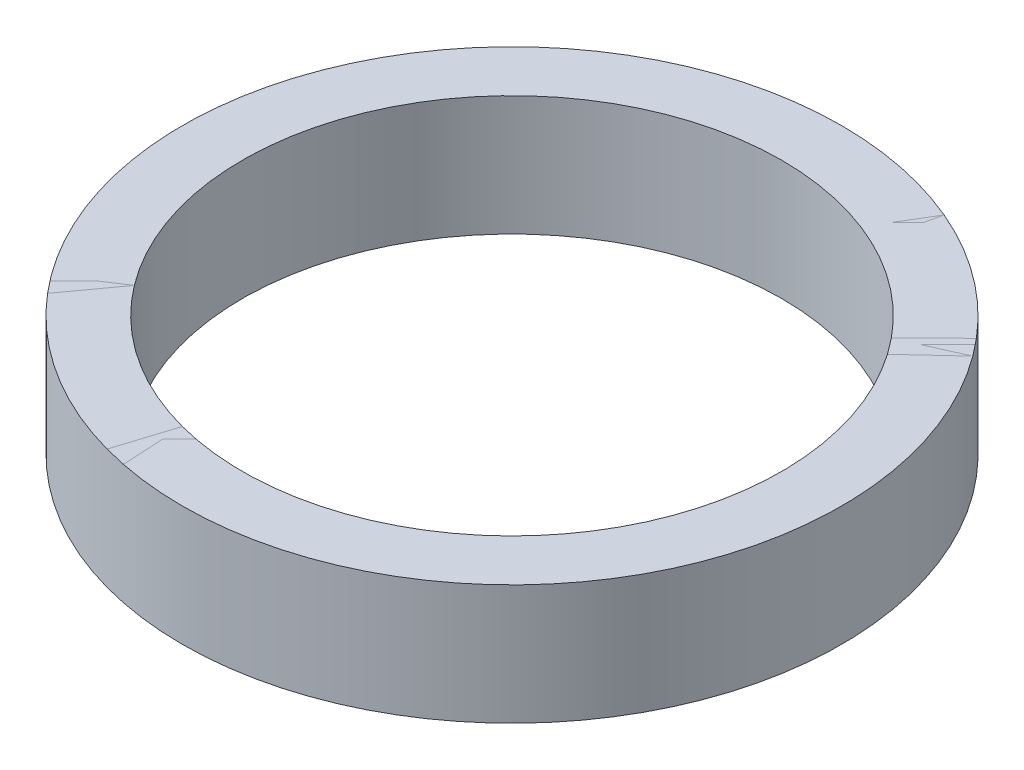
ISO-10303-21;
HEADER;
FILE_DESCRIPTION(('STEP AP214'),'2;1');
FILE_NAME('part.step','',(''),(''),'','','');
FILE_SCHEMA(('AUTOMOTIVE_DESIGN { 1 0 10303 214 1 1 1 1 }'));
ENDSEC;
DATA;
#1=APPLICATION_CONTEXT('core data for automotive mechanical design processes');
#2=APPLICATION_PROTOCOL_DEFINITION('international standard','automotive_design',2000,#1);
#3=PRODUCT_CONTEXT('',#1,'mechanical');
#4=PRODUCT('Part','Part','',(#3));
#5=PRODUCT_RELATED_PRODUCT_CATEGORY('part','',(#4));
#6=PRODUCT_DEFINITION_FORMATION('','',#4);
#7=PRODUCT_DEFINITION_CONTEXT('part definition',#1,'design');
#8=PRODUCT_DEFINITION('design','',#6,#7);
#9=PRODUCT_DEFINITION_SHAPE('','',#8);
#10=(LENGTH_UNIT() NAMED_UNIT(*) SI_UNIT(.MILLI.,.METRE.));
#11=(NAMED_UNIT(*) PLANE_ANGLE_UNIT() SI_UNIT($,.RADIAN.));
#12=(NAMED_UNIT(*) SI_UNIT($,.STERADIAN.) SOLID_ANGLE_UNIT());
#13=UNCERTAINTY_MEASURE_WITH_UNIT(LENGTH_MEASURE(1.E-05),#10,'distance_accuracy_value','');
#14=(GEOMETRIC_REPRESENTATION_CONTEXT(3) GLOBAL_UNCERTAINTY_ASSIGNED_CONTEXT((#13)) GLOBAL_UNIT_ASSIGNED_CONTEXT((#10,
#11,#12)) REPRESENTATION_CONTEXT('',''));
#15=CARTESIAN_POINT('',(0.,0.,0.));
#16=DIRECTION('',(0.,0.,1.));
#17=DIRECTION('',(1.,0.,0.));
#18=AXIS2_PLACEMENT_3D('',#15,#16,#17);
#19=CARTESIAN_POINT('',(44.9999999999999,-80.,0.));
#20=DIRECTION('',(0.,-1.,0.));
#21=DIRECTION('',(0.,0.,-1.));
#22=AXIS2_PLACEMENT_3D('',#19,#20,#21);
#23=PLANE('',#22);
#24=CARTESIAN_POINT('',(0.,-80.,0.));
#25=DIRECTION('',(0.,-1.,0.));
#26=DIRECTION('',(0.,0.,-1.));
#27=AXIS2_PLACEMENT_3D('',#24,#25,#26);
#28=CIRCLE('',#27,54.9999999999999);
#29=CARTESIAN_POINT('',(0.,-80.,-54.9999999999999));
#30=VERTEX_POINT('',#29);
#31=EDGE_CURVE('E52',#30,#30,#28,.T.);
#32=ORIENTED_EDGE('',*,*,#31,.T.);
#33=EDGE_LOOP('',(#32));
#34=FACE_BOUND('',#33,.T.);
#35=CARTESIAN_POINT('',(0.,-80.,0.));
#36=DIRECTION('',(0.,-1.,0.));
#37=DIRECTION('',(0.,0.,-1.));
#38=AXIS2_PLACEMENT_3D('',#35,#36,#37);
#39=CIRCLE('',#38,44.9999999999999);
#40=CARTESIAN_POINT('',(0.,-80.,-44.9999999999999));
#41=VERTEX_POINT('',#40);
#42=EDGE_CURVE('E11',#41,#41,#39,.F.);
#43=ORIENTED_EDGE('',*,*,#42,.T.);
#44=EDGE_LOOP('',(#43));
#45=FACE_BOUND('',#44,.T.);
#46=ADVANCED_FACE('F48',(#34,#45),#23,.T.);
#47=OPEN_SHELL('',(#46));
#48=SHELL_BASED_SURFACE_MODEL('B2',(#47));
#49=CARTESIAN_POINT('',(0.,-110.603092707212,0.));
#50=DIRECTION('',(0.,-1.,0.));
#51=DIRECTION('',(0.,0.,-1.));
#52=AXIS2_PLACEMENT_3D('',#49,#50,#51);
#53=CYLINDRICAL_SURFACE('',#52,44.9999999999999);
#54=CARTESIAN_POINT('',(0.,-80.,0.));
#55=DIRECTION('',(0.,-1.,0.));
#56=DIRECTION('',(0.,0.,-1.));
#57=AXIS2_PLACEMENT_3D('',#54,#55,#56);
#58=CIRCLE('',#57,44.9999999999999);
#59=CARTESIAN_POINT('',(0.,-80.,-44.9999999999999));
#60=VERTEX_POINT('',#59);
#61=EDGE_CURVE('E47',#60,#60,#58,.T.);
#62=ORIENTED_EDGE('',*,*,#61,.F.);
#63=EDGE_LOOP('',(#62));
#64=FACE_BOUND('',#63,.T.);
#65=CARTESIAN_POINT('',(0.,-100.,0.));
#66=DIRECTION('',(0.,-1.,0.));
#67=DIRECTION('',(0.,0.,-1.));
#68=AXIS2_PLACEMENT_3D('',#65,#66,#67);
#69=CIRCLE('',#68,44.9999999999999);
#70=CARTESIAN_POINT('',(0.,-100.,-44.9999999999999));
#71=VERTEX_POINT('',#70);
#72=EDGE_CURVE('E87',#71,#71,#69,.T.);
#73=ORIENTED_EDGE('',*,*,#72,.T.);
#74=EDGE_LOOP('',(#73));
#75=FACE_BOUND('',#74,.T.);
#76=ADVANCED_FACE('F73',(#64,#75),#53,.F.);
#77=CARTESIAN_POINT('',(44.9999999999999,-100.,0.));
#78=DIRECTION('',(0.,-1.,0.));
#79=DIRECTION('',(0.,0.,-1.));
#80=AXIS2_PLACEMENT_3D('',#77,#78,#79);
#81=PLANE('',#80);
#82=CARTESIAN_POINT('',(0.,-100.,0.));
#83=DIRECTION('',(0.,-1.,0.));
#84=DIRECTION('',(0.,0.,-1.));
#85=AXIS2_PLACEMENT_3D('',#82,#83,#84);
#86=CIRCLE('',#85,54.9999999999999);
#87=CARTESIAN_POINT('',(0.,-100.,-54.9999999999999));
#88=VERTEX_POINT('',#87);
#89=EDGE_CURVE('E93',#88,#88,#86,.T.);
#90=ORIENTED_EDGE('',*,*,#89,.T.);
#91=EDGE_LOOP('',(#90));
#92=FACE_BOUND('',#91,.T.);
#93=ORIENTED_EDGE('',*,*,#72,.F.);
#94=EDGE_LOOP('',(#93));
#95=FACE_BOUND('',#94,.T.);
#96=ADVANCED_FACE('F99',(#92,#95),#81,.T.);
#97=CARTESIAN_POINT('',(0.,-110.603092707212,0.));
#98=DIRECTION('',(0.,-1.,0.));
#99=DIRECTION('',(0.,0.,-1.));
#100=AXIS2_PLACEMENT_3D('',#97,#98,#99);
#101=CYLINDRICAL_SURFACE('',#100,54.9999999999999);
#102=CARTESIAN_POINT('',(0.,-80.,0.));
#103=DIRECTION('',(0.,-1.,0.));
#104=DIRECTION('',(0.,0.,-1.));
#105=AXIS2_PLACEMENT_3D('',#102,#103,#104);
#106=CIRCLE('',#105,54.9999999999999);
#107=CARTESIAN_POINT('',(0.,-80.,-54.9999999999999));
#108=VERTEX_POINT('',#107);
#109=EDGE_CURVE('E80',#108,#108,#106,.F.);
#110=ORIENTED_EDGE('',*,*,#109,.F.);
#111=EDGE_LOOP('',(#110));
#112=FACE_BOUND('',#111,.T.);
#113=ORIENTED_EDGE('',*,*,#89,.F.);
#114=EDGE_LOOP('',(#113));
#115=FACE_BOUND('',#114,.T.);
#116=ADVANCED_FACE('F102',(#112,#115),#101,.T.);
#117=CARTESIAN_POINT('',(44.9999999999999,-80.,0.));
#118=DIRECTION('',(0.,-1.,0.));
#119=DIRECTION('',(0.,0.,-1.));
#120=AXIS2_PLACEMENT_3D('',#117,#118,#119);
#121=PLANE('',#120);
#122=ORIENTED_EDGE('',*,*,#109,.T.);
#123=EDGE_LOOP('',(#122));
#124=FACE_BOUND('',#123,.T.);
#125=ORIENTED_EDGE('',*,*,#61,.T.);
#126=EDGE_LOOP('',(#125));
#127=FACE_BOUND('',#126,.T.);
#128=ADVANCED_FACE('F104',(#124,#127),#121,.F.);
#129=CLOSED_SHELL('',(#76,#96,#116,#128));
#130=MANIFOLD_SOLID_BREP('B6',#129);
#131=ADVANCED_BREP_SHAPE_REPRESENTATION('',(#18,#130),#14);
#132=MANIFOLD_SURFACE_SHAPE_REPRESENTATION('',(#18,#48),#14);
#133=SHAPE_REPRESENTATION('',(#18),#14);
#134=SHAPE_DEFINITION_REPRESENTATION(#9,#133);
#135=SHAPE_REPRESENTATION_RELATIONSHIP('','',#133,#131);
#136=SHAPE_REPRESENTATION_RELATIONSHIP('','',#133,#132);
ENDSEC;
END-ISO-10303-21;
